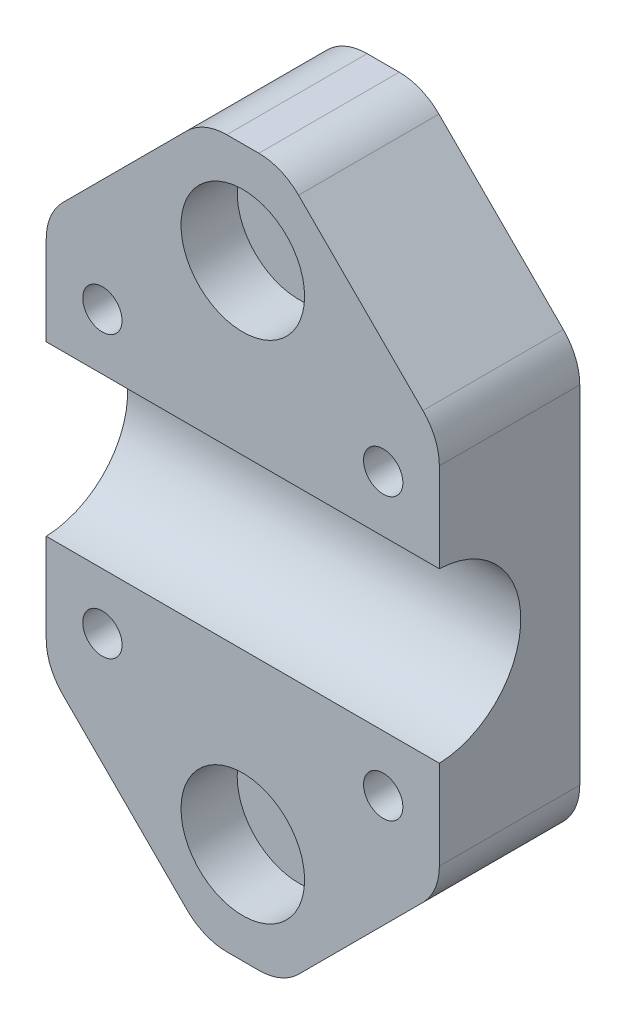
ISO-10303-21;
HEADER;
FILE_DESCRIPTION(('STEP AP214'),'2;1');
FILE_NAME('part.step','',(''),(''),'','','');
FILE_SCHEMA(('AUTOMOTIVE_DESIGN { 1 0 10303 214 1 1 1 1 }'));
ENDSEC;
DATA;
#1=APPLICATION_CONTEXT('core data for automotive mechanical design processes');
#2=APPLICATION_PROTOCOL_DEFINITION('international standard','automotive_design',2000,#1);
#3=PRODUCT_CONTEXT('',#1,'mechanical');
#4=PRODUCT('Part','Part','',(#3));
#5=PRODUCT_RELATED_PRODUCT_CATEGORY('part','',(#4));
#6=PRODUCT_DEFINITION_FORMATION('','',#4);
#7=PRODUCT_DEFINITION_CONTEXT('part definition',#1,'design');
#8=PRODUCT_DEFINITION('design','',#6,#7);
#9=PRODUCT_DEFINITION_SHAPE('','',#8);
#10=(LENGTH_UNIT() NAMED_UNIT(*) SI_UNIT(.MILLI.,.METRE.));
#11=(NAMED_UNIT(*) PLANE_ANGLE_UNIT() SI_UNIT($,.RADIAN.));
#12=(NAMED_UNIT(*) SI_UNIT($,.STERADIAN.) SOLID_ANGLE_UNIT());
#13=UNCERTAINTY_MEASURE_WITH_UNIT(LENGTH_MEASURE(1.E-05),#10,'distance_accuracy_value','');
#14=(GEOMETRIC_REPRESENTATION_CONTEXT(3) GLOBAL_UNCERTAINTY_ASSIGNED_CONTEXT((#13)) GLOBAL_UNIT_ASSIGNED_CONTEXT((#10,
#11,#12)) REPRESENTATION_CONTEXT('',''));
#15=CARTESIAN_POINT('',(0.,0.,0.));
#16=DIRECTION('',(0.,0.,1.));
#17=DIRECTION('',(1.,0.,0.));
#18=AXIS2_PLACEMENT_3D('',#15,#16,#17);
#19=CARTESIAN_POINT('',(0.,0.,12.5));
#20=DIRECTION('',(0.,0.,1.));
#21=DIRECTION('',(1.,0.,0.));
#22=AXIS2_PLACEMENT_3D('',#19,#20,#21);
#23=PLANE('',#22);
#24=CARTESIAN_POINT('',(-12.5,-12.5,12.5));
#25=DIRECTION('',(0.,0.,1.));
#26=DIRECTION('',(-1.,0.,0.));
#27=AXIS2_PLACEMENT_3D('',#24,#25,#26);
#28=CIRCLE('',#27,1.75);
#29=CARTESIAN_POINT('',(-14.25,-12.5,12.5));
#30=VERTEX_POINT('',#29);
#31=EDGE_CURVE('E529',#30,#30,#28,.T.);
#32=ORIENTED_EDGE('',*,*,#31,.F.);
#33=EDGE_LOOP('',(#32));
#34=FACE_BOUND('',#33,.T.);
#35=CARTESIAN_POINT('',(12.5,-12.5,12.5));
#36=DIRECTION('',(0.,0.,1.));
#37=DIRECTION('',(1.,0.,0.));
#38=AXIS2_PLACEMENT_3D('',#35,#36,#37);
#39=CIRCLE('',#38,1.75);
#40=CARTESIAN_POINT('',(14.25,-12.5,12.5));
#41=VERTEX_POINT('',#40);
#42=EDGE_CURVE('E528',#41,#41,#39,.T.);
#43=ORIENTED_EDGE('',*,*,#42,.F.);
#44=EDGE_LOOP('',(#43));
#45=FACE_BOUND('',#44,.T.);
#46=CARTESIAN_POINT('',(0.,-22.5,12.5));
#47=DIRECTION('',(0.,0.,1.));
#48=DIRECTION('',(-1.,0.,0.));
#49=AXIS2_PLACEMENT_3D('',#46,#47,#48);
#50=CIRCLE('',#49,5.5);
#51=CARTESIAN_POINT('',(-5.5,-22.5,12.5));
#52=VERTEX_POINT('',#51);
#53=EDGE_CURVE('E412',#52,#52,#50,.T.);
#54=ORIENTED_EDGE('',*,*,#53,.F.);
#55=EDGE_LOOP('',(#54));
#56=FACE_BOUND('',#55,.T.);
#57=DIRECTION('',(0.707106781186547,-0.707106781186547,0.));
#58=VECTOR('',#57,1.);
#59=CARTESIAN_POINT('',(-3.5,-31.5,12.5));
#60=LINE('',#59,#58);
#61=CARTESIAN_POINT('',(-16.0355339059327,-18.9644660940673,12.5));
#62=VERTEX_POINT('',#61);
#63=CARTESIAN_POINT('',(-4.96446609406727,-30.0355339059327,12.5));
#64=VERTEX_POINT('',#63);
#65=EDGE_CURVE('E171',#62,#64,#60,.T.);
#66=ORIENTED_EDGE('',*,*,#65,.T.);
#67=CARTESIAN_POINT('',(-1.42893218813453,-26.5,12.5));
#68=DIRECTION('',(0.,0.,1.));
#69=DIRECTION('',(1.,0.,0.));
#70=AXIS2_PLACEMENT_3D('',#67,#68,#69);
#71=CIRCLE('',#70,5.);
#72=CARTESIAN_POINT('',(-1.42893218813453,-31.5,12.5));
#73=VERTEX_POINT('',#72);
#74=EDGE_CURVE('E269',#64,#73,#71,.T.);
#75=ORIENTED_EDGE('',*,*,#74,.T.);
#76=DIRECTION('',(1.,0.,0.));
#77=VECTOR('',#76,1.);
#78=CARTESIAN_POINT('',(3.5,-31.5,12.5));
#79=LINE('',#78,#77);
#80=CARTESIAN_POINT('',(1.42893218813453,-31.5,12.5));
#81=VERTEX_POINT('',#80);
#82=EDGE_CURVE('E205',#73,#81,#79,.T.);
#83=ORIENTED_EDGE('',*,*,#82,.T.);
#84=CARTESIAN_POINT('',(1.42893218813453,-26.5,12.5));
#85=DIRECTION('',(0.,0.,1.));
#86=DIRECTION('',(1.,0.,0.));
#87=AXIS2_PLACEMENT_3D('',#84,#85,#86);
#88=CIRCLE('',#87,5.);
#89=CARTESIAN_POINT('',(4.96446609406726,-30.0355339059327,12.5));
#90=VERTEX_POINT('',#89);
#91=EDGE_CURVE('E267',#81,#90,#88,.T.);
#92=ORIENTED_EDGE('',*,*,#91,.T.);
#93=DIRECTION('',(0.707106781186547,0.707106781186547,0.));
#94=VECTOR('',#93,1.);
#95=CARTESIAN_POINT('',(3.5,-31.5,12.5));
#96=LINE('',#95,#94);
#97=CARTESIAN_POINT('',(16.0355339059327,-18.9644660940673,12.5));
#98=VERTEX_POINT('',#97);
#99=EDGE_CURVE('E208',#90,#98,#96,.T.);
#100=ORIENTED_EDGE('',*,*,#99,.T.);
#101=CARTESIAN_POINT('',(12.5,-15.4289321881345,12.5));
#102=DIRECTION('',(0.,0.,1.));
#103=DIRECTION('',(1.,0.,0.));
#104=AXIS2_PLACEMENT_3D('',#101,#102,#103);
#105=CIRCLE('',#104,5.);
#106=CARTESIAN_POINT('',(17.5,-15.4289321881345,12.5));
#107=VERTEX_POINT('',#106);
#108=EDGE_CURVE('E265',#98,#107,#105,.T.);
#109=ORIENTED_EDGE('',*,*,#108,.T.);
#110=DIRECTION('',(0.,1.,0.));
#111=VECTOR('',#110,1.);
#112=CARTESIAN_POINT('',(17.5,17.5,12.5));
#113=LINE('',#112,#111);
#114=CARTESIAN_POINT('',(17.5,-7.49583217528247,12.5));
#115=VERTEX_POINT('',#114);
#116=EDGE_CURVE('E212',#107,#115,#113,.T.);
#117=ORIENTED_EDGE('',*,*,#116,.T.);
#118=DIRECTION('',(1.,0.,0.));
#119=VECTOR('',#118,1.);
#120=CARTESIAN_POINT('',(-17.501,-7.49583217528247,12.5));
#121=LINE('',#120,#119);
#122=CARTESIAN_POINT('',(-17.5,-7.49583217528247,12.5));
#123=VERTEX_POINT('',#122);
#124=EDGE_CURVE('E181',#123,#115,#121,.T.);
#125=ORIENTED_EDGE('',*,*,#124,.F.);
#126=DIRECTION('',(0.,-1.,0.));
#127=VECTOR('',#126,1.);
#128=CARTESIAN_POINT('',(-17.5,17.5,12.5));
#129=LINE('',#128,#127);
#130=CARTESIAN_POINT('',(-17.5,-15.4289321881345,12.5));
#131=VERTEX_POINT('',#130);
#132=EDGE_CURVE('E172',#123,#131,#129,.T.);
#133=ORIENTED_EDGE('',*,*,#132,.T.);
#134=CARTESIAN_POINT('',(-12.5,-15.4289321881345,12.5));
#135=DIRECTION('',(0.,0.,1.));
#136=DIRECTION('',(1.,0.,0.));
#137=AXIS2_PLACEMENT_3D('',#134,#135,#136);
#138=CIRCLE('',#137,5.);
#139=EDGE_CURVE('E263',#131,#62,#138,.T.);
#140=ORIENTED_EDGE('',*,*,#139,.T.);
#141=EDGE_LOOP('',(#66,#75,#83,#92,#100,#109,#117,#125,#133,#140));
#142=FACE_BOUND('',#141,.T.);
#143=ADVANCED_FACE('F37',(#34,#45,#56,#142),#23,.T.);
#144=CARTESIAN_POINT('',(3.5,31.5,12.5));
#145=DIRECTION('',(0.,-1.,0.));
#146=DIRECTION('',(0.,0.,-1.));
#147=AXIS2_PLACEMENT_3D('',#144,#145,#146);
#148=PLANE('',#147);
#149=DIRECTION('',(-1.,0.,0.));
#150=VECTOR('',#149,1.);
#151=CARTESIAN_POINT('',(3.5,31.5,12.5));
#152=LINE('',#151,#150);
#153=CARTESIAN_POINT('',(1.42893218813453,31.5,12.5));
#154=VERTEX_POINT('',#153);
#155=CARTESIAN_POINT('',(-1.42893218813453,31.5,12.5));
#156=VERTEX_POINT('',#155);
#157=EDGE_CURVE('E197',#154,#156,#152,.T.);
#158=ORIENTED_EDGE('',*,*,#157,.F.);
#159=DIRECTION('',(0.,0.,-1.));
#160=VECTOR('',#159,1.);
#161=CARTESIAN_POINT('',(1.42893218813453,31.5,12.5));
#162=LINE('',#161,#160);
#163=CARTESIAN_POINT('',(1.42893218813453,31.5,0.));
#164=VERTEX_POINT('',#163);
#165=EDGE_CURVE('E299',#154,#164,#162,.T.);
#166=ORIENTED_EDGE('',*,*,#165,.T.);
#167=DIRECTION('',(-1.,0.,0.));
#168=VECTOR('',#167,1.);
#169=CARTESIAN_POINT('',(3.5,31.5,0.));
#170=LINE('',#169,#168);
#171=CARTESIAN_POINT('',(-1.42893218813453,31.5,0.));
#172=VERTEX_POINT('',#171);
#173=EDGE_CURVE('E195',#164,#172,#170,.T.);
#174=ORIENTED_EDGE('',*,*,#173,.T.);
#175=DIRECTION('',(0.,0.,-1.));
#176=VECTOR('',#175,1.);
#177=CARTESIAN_POINT('',(-1.42893218813453,31.5,12.5));
#178=LINE('',#177,#176);
#179=EDGE_CURVE('E297',#172,#156,#178,.F.);
#180=ORIENTED_EDGE('',*,*,#179,.T.);
#181=EDGE_LOOP('',(#158,#166,#174,#180));
#182=FACE_BOUND('',#181,.T.);
#183=ADVANCED_FACE('F305',(#182),#148,.F.);
#184=CARTESIAN_POINT('',(-3.5,31.5,12.5));
#185=DIRECTION('',(0.707106781186547,-0.707106781186547,0.));
#186=DIRECTION('',(0.707106781186547,0.707106781186548,0.));
#187=AXIS2_PLACEMENT_3D('',#184,#185,#186);
#188=PLANE('',#187);
#189=DIRECTION('',(-0.707106781186547,-0.707106781186547,0.));
#190=VECTOR('',#189,1.);
#191=CARTESIAN_POINT('',(-3.5,31.5,12.5));
#192=LINE('',#191,#190);
#193=CARTESIAN_POINT('',(-4.96446609406727,30.0355339059327,12.5));
#194=VERTEX_POINT('',#193);
#195=CARTESIAN_POINT('',(-16.0355339059327,18.9644660940673,12.5));
#196=VERTEX_POINT('',#195);
#197=EDGE_CURVE('E200',#194,#196,#192,.T.);
#198=ORIENTED_EDGE('',*,*,#197,.F.);
#199=DIRECTION('',(0.,0.,-1.));
#200=VECTOR('',#199,1.);
#201=CARTESIAN_POINT('',(-4.96446609406727,30.0355339059327,12.5));
#202=LINE('',#201,#200);
#203=CARTESIAN_POINT('',(-4.96446609406727,30.0355339059327,0.));
#204=VERTEX_POINT('',#203);
#205=EDGE_CURVE('E11',#194,#204,#202,.T.);
#206=ORIENTED_EDGE('',*,*,#205,.T.);
#207=DIRECTION('',(-0.707106781186547,-0.707106781186547,0.));
#208=VECTOR('',#207,1.);
#209=CARTESIAN_POINT('',(-3.5,31.5,0.));
#210=LINE('',#209,#208);
#211=CARTESIAN_POINT('',(-16.0355339059327,18.9644660940673,0.));
#212=VERTEX_POINT('',#211);
#213=EDGE_CURVE('E220',#204,#212,#210,.T.);
#214=ORIENTED_EDGE('',*,*,#213,.T.);
#215=DIRECTION('',(0.,0.,-1.));
#216=VECTOR('',#215,1.);
#217=CARTESIAN_POINT('',(-16.0355339059327,18.9644660940673,12.5));
#218=LINE('',#217,#216);
#219=EDGE_CURVE('E45',#212,#196,#218,.F.);
#220=ORIENTED_EDGE('',*,*,#219,.T.);
#221=EDGE_LOOP('',(#198,#206,#214,#220));
#222=FACE_BOUND('',#221,.T.);
#223=ADVANCED_FACE('F318',(#222),#188,.F.);
#224=CARTESIAN_POINT('',(-17.5,17.5,12.5));
#225=DIRECTION('',(1.,0.,0.));
#226=DIRECTION('',(0.,0.,-1.));
#227=AXIS2_PLACEMENT_3D('',#224,#225,#226);
#228=PLANE('',#227);
#229=DIRECTION('',(0.,-1.,0.));
#230=VECTOR('',#229,1.);
#231=CARTESIAN_POINT('',(-17.5,17.5,0.));
#232=LINE('',#231,#230);
#233=CARTESIAN_POINT('',(-17.5,15.4289321881345,0.));
#234=VERTEX_POINT('',#233);
#235=CARTESIAN_POINT('',(-17.5,-15.4289321881345,0.));
#236=VERTEX_POINT('',#235);
#237=EDGE_CURVE('E222',#234,#236,#232,.T.);
#238=ORIENTED_EDGE('',*,*,#237,.T.);
#239=DIRECTION('',(0.,0.,-1.));
#240=VECTOR('',#239,1.);
#241=CARTESIAN_POINT('',(-17.5,-15.4289321881345,12.5));
#242=LINE('',#241,#240);
#243=EDGE_CURVE('E295',#236,#131,#242,.F.);
#244=ORIENTED_EDGE('',*,*,#243,.T.);
#245=ORIENTED_EDGE('',*,*,#132,.F.);
#246=CARTESIAN_POINT('',(-17.5,0.,12.75));
#247=DIRECTION('',(1.,0.,0.));
#248=DIRECTION('',(0.,0.,-1.));
#249=AXIS2_PLACEMENT_3D('',#246,#247,#248);
#250=CIRCLE('',#249,7.5);
#251=CARTESIAN_POINT('',(-17.5,7.49583217528247,12.5));
#252=VERTEX_POINT('',#251);
#253=EDGE_CURVE('E177',#252,#123,#250,.F.);
#254=ORIENTED_EDGE('',*,*,#253,.F.);
#255=CARTESIAN_POINT('',(-17.5,15.4289321881345,12.5));
#256=VERTEX_POINT('',#255);
#257=EDGE_CURVE('E161',#256,#252,#129,.T.);
#258=ORIENTED_EDGE('',*,*,#257,.F.);
#259=DIRECTION('',(0.,0.,-1.));
#260=VECTOR('',#259,1.);
#261=CARTESIAN_POINT('',(-17.5,15.4289321881345,12.5));
#262=LINE('',#261,#260);
#263=EDGE_CURVE('E293',#256,#234,#262,.T.);
#264=ORIENTED_EDGE('',*,*,#263,.T.);
#265=EDGE_LOOP('',(#238,#244,#245,#254,#258,#264));
#266=FACE_BOUND('',#265,.T.);
#267=ADVANCED_FACE('F185',(#266),#228,.F.);
#268=CARTESIAN_POINT('',(-3.5,-31.5,12.5));
#269=DIRECTION('',(0.707106781186547,0.707106781186547,0.));
#270=DIRECTION('',(-0.707106781186547,0.707106781186548,0.));
#271=AXIS2_PLACEMENT_3D('',#268,#269,#270);
#272=PLANE('',#271);
#273=DIRECTION('',(0.707106781186547,-0.707106781186547,0.));
#274=VECTOR('',#273,1.);
#275=CARTESIAN_POINT('',(-3.5,-31.5,0.));
#276=LINE('',#275,#274);
#277=CARTESIAN_POINT('',(-16.0355339059327,-18.9644660940673,0.));
#278=VERTEX_POINT('',#277);
#279=CARTESIAN_POINT('',(-4.96446609406727,-30.0355339059327,0.));
#280=VERTEX_POINT('',#279);
#281=EDGE_CURVE('E224',#278,#280,#276,.T.);
#282=ORIENTED_EDGE('',*,*,#281,.T.);
#283=DIRECTION('',(0.,0.,-1.));
#284=VECTOR('',#283,1.);
#285=CARTESIAN_POINT('',(-4.96446609406727,-30.0355339059327,12.5));
#286=LINE('',#285,#284);
#287=EDGE_CURVE('E261',#280,#64,#286,.F.);
#288=ORIENTED_EDGE('',*,*,#287,.T.);
#289=ORIENTED_EDGE('',*,*,#65,.F.);
#290=DIRECTION('',(0.,0.,-1.));
#291=VECTOR('',#290,1.);
#292=CARTESIAN_POINT('',(-16.0355339059327,-18.9644660940673,12.5));
#293=LINE('',#292,#291);
#294=EDGE_CURVE('E258',#62,#278,#293,.T.);
#295=ORIENTED_EDGE('',*,*,#294,.T.);
#296=EDGE_LOOP('',(#282,#288,#289,#295));
#297=FACE_BOUND('',#296,.T.);
#298=ADVANCED_FACE('F329',(#297),#272,.F.);
#299=CARTESIAN_POINT('',(3.5,-31.5,12.5));
#300=DIRECTION('',(0.,1.,0.));
#301=DIRECTION('',(0.,0.,1.));
#302=AXIS2_PLACEMENT_3D('',#299,#300,#301);
#303=PLANE('',#302);
#304=ORIENTED_EDGE('',*,*,#82,.F.);
#305=DIRECTION('',(0.,0.,-1.));
#306=VECTOR('',#305,1.);
#307=CARTESIAN_POINT('',(-1.42893218813453,-31.5,12.5));
#308=LINE('',#307,#306);
#309=CARTESIAN_POINT('',(-1.42893218813453,-31.5,0.));
#310=VERTEX_POINT('',#309);
#311=EDGE_CURVE('E239',#73,#310,#308,.T.);
#312=ORIENTED_EDGE('',*,*,#311,.T.);
#313=DIRECTION('',(1.,0.,0.));
#314=VECTOR('',#313,1.);
#315=CARTESIAN_POINT('',(3.5,-31.5,0.));
#316=LINE('',#315,#314);
#317=CARTESIAN_POINT('',(1.42893218813453,-31.5,0.));
#318=VERTEX_POINT('',#317);
#319=EDGE_CURVE('E227',#310,#318,#316,.T.);
#320=ORIENTED_EDGE('',*,*,#319,.T.);
#321=DIRECTION('',(0.,0.,-1.));
#322=VECTOR('',#321,1.);
#323=CARTESIAN_POINT('',(1.42893218813453,-31.5,12.5));
#324=LINE('',#323,#322);
#325=EDGE_CURVE('E217',#318,#81,#324,.F.);
#326=ORIENTED_EDGE('',*,*,#325,.T.);
#327=EDGE_LOOP('',(#304,#312,#320,#326));
#328=FACE_BOUND('',#327,.T.);
#329=ADVANCED_FACE('F338',(#328),#303,.F.);
#330=CARTESIAN_POINT('',(3.5,-31.5,12.5));
#331=DIRECTION('',(-0.707106781186547,0.707106781186547,0.));
#332=DIRECTION('',(-0.707106781186547,-0.707106781186548,0.));
#333=AXIS2_PLACEMENT_3D('',#330,#331,#332);
#334=PLANE('',#333);
#335=ORIENTED_EDGE('',*,*,#99,.F.);
#336=DIRECTION('',(0.,0.,-1.));
#337=VECTOR('',#336,1.);
#338=CARTESIAN_POINT('',(4.96446609406726,-30.0355339059327,12.5));
#339=LINE('',#338,#337);
#340=CARTESIAN_POINT('',(4.96446609406726,-30.0355339059327,0.));
#341=VERTEX_POINT('',#340);
#342=EDGE_CURVE('E273',#90,#341,#339,.T.);
#343=ORIENTED_EDGE('',*,*,#342,.T.);
#344=DIRECTION('',(0.707106781186547,0.707106781186547,0.));
#345=VECTOR('',#344,1.);
#346=CARTESIAN_POINT('',(3.5,-31.5,0.));
#347=LINE('',#346,#345);
#348=CARTESIAN_POINT('',(16.0355339059327,-18.9644660940673,0.));
#349=VERTEX_POINT('',#348);
#350=EDGE_CURVE('E230',#341,#349,#347,.T.);
#351=ORIENTED_EDGE('',*,*,#350,.T.);
#352=DIRECTION('',(0.,0.,-1.));
#353=VECTOR('',#352,1.);
#354=CARTESIAN_POINT('',(16.0355339059327,-18.9644660940673,12.5));
#355=LINE('',#354,#353);
#356=EDGE_CURVE('E271',#349,#98,#355,.F.);
#357=ORIENTED_EDGE('',*,*,#356,.T.);
#358=EDGE_LOOP('',(#335,#343,#351,#357));
#359=FACE_BOUND('',#358,.T.);
#360=ADVANCED_FACE('F347',(#359),#334,.F.);
#361=CARTESIAN_POINT('',(17.5,17.5,12.5));
#362=DIRECTION('',(-1.,0.,0.));
#363=DIRECTION('',(0.,0.,1.));
#364=AXIS2_PLACEMENT_3D('',#361,#362,#363);
#365=PLANE('',#364);
#366=ORIENTED_EDGE('',*,*,#116,.F.);
#367=DIRECTION('',(0.,0.,-1.));
#368=VECTOR('',#367,1.);
#369=CARTESIAN_POINT('',(17.5,-15.4289321881345,12.5));
#370=LINE('',#369,#368);
#371=CARTESIAN_POINT('',(17.5,-15.4289321881345,0.));
#372=VERTEX_POINT('',#371);
#373=EDGE_CURVE('E278',#107,#372,#370,.T.);
#374=ORIENTED_EDGE('',*,*,#373,.T.);
#375=DIRECTION('',(0.,1.,0.));
#376=VECTOR('',#375,1.);
#377=CARTESIAN_POINT('',(17.5,17.5,0.));
#378=LINE('',#377,#376);
#379=CARTESIAN_POINT('',(17.5,15.4289321881345,0.));
#380=VERTEX_POINT('',#379);
#381=EDGE_CURVE('E233',#372,#380,#378,.T.);
#382=ORIENTED_EDGE('',*,*,#381,.T.);
#383=DIRECTION('',(0.,0.,-1.));
#384=VECTOR('',#383,1.);
#385=CARTESIAN_POINT('',(17.5,15.4289321881345,12.5));
#386=LINE('',#385,#384);
#387=CARTESIAN_POINT('',(17.5,15.4289321881345,12.5));
#388=VERTEX_POINT('',#387);
#389=EDGE_CURVE('E276',#380,#388,#386,.F.);
#390=ORIENTED_EDGE('',*,*,#389,.T.);
#391=CARTESIAN_POINT('',(17.5,7.49583217528247,12.5));
#392=VERTEX_POINT('',#391);
#393=EDGE_CURVE('E211',#392,#388,#113,.T.);
#394=ORIENTED_EDGE('',*,*,#393,.F.);
#395=CARTESIAN_POINT('',(17.5,0.,12.75));
#396=DIRECTION('',(1.,0.,0.));
#397=DIRECTION('',(0.,0.,-1.));
#398=AXIS2_PLACEMENT_3D('',#395,#396,#397);
#399=CIRCLE('',#398,7.5);
#400=EDGE_CURVE('E180',#115,#392,#399,.T.);
#401=ORIENTED_EDGE('',*,*,#400,.F.);
#402=EDGE_LOOP('',(#366,#374,#382,#390,#394,#401));
#403=FACE_BOUND('',#402,.T.);
#404=ADVANCED_FACE('F356',(#403),#365,.F.);
#405=CARTESIAN_POINT('',(3.5,31.5,12.5));
#406=DIRECTION('',(-0.707106781186547,-0.707106781186547,0.));
#407=DIRECTION('',(0.707106781186547,-0.707106781186548,0.));
#408=AXIS2_PLACEMENT_3D('',#405,#406,#407);
#409=PLANE('',#408);
#410=DIRECTION('',(-0.707106781186547,0.707106781186547,0.));
#411=VECTOR('',#410,1.);
#412=CARTESIAN_POINT('',(3.5,31.5,12.5));
#413=LINE('',#412,#411);
#414=CARTESIAN_POINT('',(16.0355339059327,18.9644660940673,12.5));
#415=VERTEX_POINT('',#414);
#416=CARTESIAN_POINT('',(4.96446609406726,30.0355339059327,12.5));
#417=VERTEX_POINT('',#416);
#418=EDGE_CURVE('E214',#415,#417,#413,.T.);
#419=ORIENTED_EDGE('',*,*,#418,.F.);
#420=DIRECTION('',(0.,0.,-1.));
#421=VECTOR('',#420,1.);
#422=CARTESIAN_POINT('',(16.0355339059327,18.9644660940673,12.5));
#423=LINE('',#422,#421);
#424=CARTESIAN_POINT('',(16.0355339059327,18.9644660940673,0.));
#425=VERTEX_POINT('',#424);
#426=EDGE_CURVE('E283',#415,#425,#423,.T.);
#427=ORIENTED_EDGE('',*,*,#426,.T.);
#428=DIRECTION('',(-0.707106781186547,0.707106781186547,0.));
#429=VECTOR('',#428,1.);
#430=CARTESIAN_POINT('',(3.5,31.5,0.));
#431=LINE('',#430,#429);
#432=CARTESIAN_POINT('',(4.96446609406726,30.0355339059327,0.));
#433=VERTEX_POINT('',#432);
#434=EDGE_CURVE('E201',#425,#433,#431,.T.);
#435=ORIENTED_EDGE('',*,*,#434,.T.);
#436=DIRECTION('',(0.,0.,-1.));
#437=VECTOR('',#436,1.);
#438=CARTESIAN_POINT('',(4.96446609406726,30.0355339059327,12.5));
#439=LINE('',#438,#437);
#440=EDGE_CURVE('E281',#433,#417,#439,.F.);
#441=ORIENTED_EDGE('',*,*,#440,.T.);
#442=EDGE_LOOP('',(#419,#427,#435,#441));
#443=FACE_BOUND('',#442,.T.);
#444=ADVANCED_FACE('F364',(#443),#409,.F.);
#445=CARTESIAN_POINT('',(12.5,12.5,12.5));
#446=DIRECTION('',(0.,0.,1.));
#447=DIRECTION('',(-1.,0.,0.));
#448=AXIS2_PLACEMENT_3D('',#445,#446,#447);
#449=CIRCLE('',#448,1.75);
#450=CARTESIAN_POINT('',(10.75,12.5,12.5));
#451=VERTEX_POINT('',#450);
#452=EDGE_CURVE('E396',#451,#451,#449,.T.);
#453=ORIENTED_EDGE('',*,*,#452,.F.);
#454=EDGE_LOOP('',(#453));
#455=FACE_BOUND('',#454,.T.);
#456=CARTESIAN_POINT('',(-12.5,12.5,12.5));
#457=DIRECTION('',(0.,0.,1.));
#458=DIRECTION('',(1.,0.,0.));
#459=AXIS2_PLACEMENT_3D('',#456,#457,#458);
#460=CIRCLE('',#459,1.75);
#461=CARTESIAN_POINT('',(-10.75,12.5,12.5));
#462=VERTEX_POINT('',#461);
#463=EDGE_CURVE('E400',#462,#462,#460,.T.);
#464=ORIENTED_EDGE('',*,*,#463,.F.);
#465=EDGE_LOOP('',(#464));
#466=FACE_BOUND('',#465,.T.);
#467=CARTESIAN_POINT('',(0.,22.5,12.5));
#468=DIRECTION('',(0.,0.,1.));
#469=DIRECTION('',(1.,0.,0.));
#470=AXIS2_PLACEMENT_3D('',#467,#468,#469);
#471=CIRCLE('',#470,5.5);
#472=CARTESIAN_POINT('',(5.5,22.5,12.5));
#473=VERTEX_POINT('',#472);
#474=EDGE_CURVE('E403',#473,#473,#471,.T.);
#475=ORIENTED_EDGE('',*,*,#474,.F.);
#476=EDGE_LOOP('',(#475));
#477=FACE_BOUND('',#476,.T.);
#478=ORIENTED_EDGE('',*,*,#393,.T.);
#479=CARTESIAN_POINT('',(12.5,15.4289321881345,12.5));
#480=DIRECTION('',(0.,0.,1.));
#481=DIRECTION('',(1.,0.,0.));
#482=AXIS2_PLACEMENT_3D('',#479,#480,#481);
#483=CIRCLE('',#482,5.);
#484=EDGE_CURVE('E291',#388,#415,#483,.T.);
#485=ORIENTED_EDGE('',*,*,#484,.T.);
#486=ORIENTED_EDGE('',*,*,#418,.T.);
#487=CARTESIAN_POINT('',(1.42893218813453,26.5,12.5));
#488=DIRECTION('',(0.,0.,1.));
#489=DIRECTION('',(1.,0.,0.));
#490=AXIS2_PLACEMENT_3D('',#487,#488,#489);
#491=CIRCLE('',#490,5.);
#492=EDGE_CURVE('E289',#417,#154,#491,.T.);
#493=ORIENTED_EDGE('',*,*,#492,.T.);
#494=ORIENTED_EDGE('',*,*,#157,.T.);
#495=CARTESIAN_POINT('',(-1.42893218813453,26.5,12.5));
#496=DIRECTION('',(0.,0.,1.));
#497=DIRECTION('',(1.,0.,0.));
#498=AXIS2_PLACEMENT_3D('',#495,#496,#497);
#499=CIRCLE('',#498,5.);
#500=EDGE_CURVE('E287',#156,#194,#499,.T.);
#501=ORIENTED_EDGE('',*,*,#500,.T.);
#502=ORIENTED_EDGE('',*,*,#197,.T.);
#503=CARTESIAN_POINT('',(-12.5,15.4289321881345,12.5));
#504=DIRECTION('',(0.,0.,1.));
#505=DIRECTION('',(1.,0.,0.));
#506=AXIS2_PLACEMENT_3D('',#503,#504,#505);
#507=CIRCLE('',#506,5.);
#508=EDGE_CURVE('E52',#196,#256,#507,.T.);
#509=ORIENTED_EDGE('',*,*,#508,.T.);
#510=ORIENTED_EDGE('',*,*,#257,.T.);
#511=DIRECTION('',(1.,0.,0.));
#512=VECTOR('',#511,1.);
#513=CARTESIAN_POINT('',(-17.501,7.49583217528247,12.5));
#514=LINE('',#513,#512);
#515=EDGE_CURVE('E165',#252,#392,#514,.T.);
#516=ORIENTED_EDGE('',*,*,#515,.T.);
#517=EDGE_LOOP('',(#478,#485,#486,#493,#494,#501,#502,#509,#510,#516));
#518=FACE_BOUND('',#517,.T.);
#519=ADVANCED_FACE('F164',(#455,#466,#477,#518),#23,.T.);
#520=CARTESIAN_POINT('',(0.,0.,0.));
#521=DIRECTION('',(0.,0.,1.));
#522=DIRECTION('',(1.,0.,0.));
#523=AXIS2_PLACEMENT_3D('',#520,#521,#522);
#524=PLANE('',#523);
#525=CARTESIAN_POINT('',(12.5,-12.5,0.));
#526=DIRECTION('',(0.,0.,-1.));
#527=DIRECTION('',(1.,0.,0.));
#528=AXIS2_PLACEMENT_3D('',#525,#526,#527);
#529=CIRCLE('',#528,3.);
#530=CARTESIAN_POINT('',(15.5,-12.5,0.));
#531=VERTEX_POINT('',#530);
#532=EDGE_CURVE('E409',#531,#531,#529,.T.);
#533=ORIENTED_EDGE('',*,*,#532,.F.);
#534=EDGE_LOOP('',(#533));
#535=FACE_BOUND('',#534,.T.);
#536=CARTESIAN_POINT('',(-12.5,-12.5,0.));
#537=DIRECTION('',(0.,0.,-1.));
#538=DIRECTION('',(-1.,0.,0.));
#539=AXIS2_PLACEMENT_3D('',#536,#537,#538);
#540=CIRCLE('',#539,3.);
#541=CARTESIAN_POINT('',(-15.5,-12.5,0.));
#542=VERTEX_POINT('',#541);
#543=EDGE_CURVE('E419',#542,#542,#540,.T.);
#544=ORIENTED_EDGE('',*,*,#543,.F.);
#545=EDGE_LOOP('',(#544));
#546=FACE_BOUND('',#545,.T.);
#547=CARTESIAN_POINT('',(-12.5,12.5,0.));
#548=DIRECTION('',(0.,0.,-1.));
#549=DIRECTION('',(1.,0.,0.));
#550=AXIS2_PLACEMENT_3D('',#547,#548,#549);
#551=CIRCLE('',#550,3.);
#552=CARTESIAN_POINT('',(-9.5,12.5,0.));
#553=VERTEX_POINT('',#552);
#554=EDGE_CURVE('E425',#553,#553,#551,.T.);
#555=ORIENTED_EDGE('',*,*,#554,.F.);
#556=EDGE_LOOP('',(#555));
#557=FACE_BOUND('',#556,.T.);
#558=CARTESIAN_POINT('',(12.5,12.5,0.));
#559=DIRECTION('',(0.,0.,-1.));
#560=DIRECTION('',(-1.,0.,0.));
#561=AXIS2_PLACEMENT_3D('',#558,#559,#560);
#562=CIRCLE('',#561,3.);
#563=CARTESIAN_POINT('',(9.5,12.5,0.));
#564=VERTEX_POINT('',#563);
#565=EDGE_CURVE('E191',#564,#564,#562,.T.);
#566=ORIENTED_EDGE('',*,*,#565,.F.);
#567=EDGE_LOOP('',(#566));
#568=FACE_BOUND('',#567,.T.);
#569=ORIENTED_EDGE('',*,*,#319,.F.);
#570=CARTESIAN_POINT('',(-1.42893218813453,-26.5,0.));
#571=DIRECTION('',(0.,0.,1.));
#572=DIRECTION('',(1.,0.,0.));
#573=AXIS2_PLACEMENT_3D('',#570,#571,#572);
#574=CIRCLE('',#573,5.);
#575=EDGE_CURVE('E256',#310,#280,#574,.F.);
#576=ORIENTED_EDGE('',*,*,#575,.T.);
#577=ORIENTED_EDGE('',*,*,#281,.F.);
#578=CARTESIAN_POINT('',(-12.5,-15.4289321881345,0.));
#579=DIRECTION('',(0.,0.,1.));
#580=DIRECTION('',(1.,0.,0.));
#581=AXIS2_PLACEMENT_3D('',#578,#579,#580);
#582=CIRCLE('',#581,5.);
#583=EDGE_CURVE('E248',#278,#236,#582,.F.);
#584=ORIENTED_EDGE('',*,*,#583,.T.);
#585=ORIENTED_EDGE('',*,*,#237,.F.);
#586=CARTESIAN_POINT('',(-12.5,15.4289321881345,0.));
#587=DIRECTION('',(0.,0.,1.));
#588=DIRECTION('',(1.,0.,0.));
#589=AXIS2_PLACEMENT_3D('',#586,#587,#588);
#590=CIRCLE('',#589,5.);
#591=EDGE_CURVE('E242',#234,#212,#590,.F.);
#592=ORIENTED_EDGE('',*,*,#591,.T.);
#593=ORIENTED_EDGE('',*,*,#213,.F.);
#594=CARTESIAN_POINT('',(-1.42893218813453,26.5,0.));
#595=DIRECTION('',(0.,0.,1.));
#596=DIRECTION('',(1.,0.,0.));
#597=AXIS2_PLACEMENT_3D('',#594,#595,#596);
#598=CIRCLE('',#597,5.);
#599=EDGE_CURVE('E244',#204,#172,#598,.F.);
#600=ORIENTED_EDGE('',*,*,#599,.T.);
#601=ORIENTED_EDGE('',*,*,#173,.F.);
#602=CARTESIAN_POINT('',(1.42893218813453,26.5,0.));
#603=DIRECTION('',(0.,0.,1.));
#604=DIRECTION('',(1.,0.,0.));
#605=AXIS2_PLACEMENT_3D('',#602,#603,#604);
#606=CIRCLE('',#605,5.);
#607=EDGE_CURVE('E246',#164,#433,#606,.F.);
#608=ORIENTED_EDGE('',*,*,#607,.T.);
#609=ORIENTED_EDGE('',*,*,#434,.F.);
#610=CARTESIAN_POINT('',(12.5,15.4289321881345,0.));
#611=DIRECTION('',(0.,0.,1.));
#612=DIRECTION('',(1.,0.,0.));
#613=AXIS2_PLACEMENT_3D('',#610,#611,#612);
#614=CIRCLE('',#613,5.);
#615=EDGE_CURVE('E250',#425,#380,#614,.F.);
#616=ORIENTED_EDGE('',*,*,#615,.T.);
#617=ORIENTED_EDGE('',*,*,#381,.F.);
#618=CARTESIAN_POINT('',(12.5,-15.4289321881345,0.));
#619=DIRECTION('',(0.,0.,1.));
#620=DIRECTION('',(1.,0.,0.));
#621=AXIS2_PLACEMENT_3D('',#618,#619,#620);
#622=CIRCLE('',#621,5.);
#623=EDGE_CURVE('E252',#372,#349,#622,.F.);
#624=ORIENTED_EDGE('',*,*,#623,.T.);
#625=ORIENTED_EDGE('',*,*,#350,.F.);
#626=CARTESIAN_POINT('',(1.42893218813453,-26.5,0.));
#627=DIRECTION('',(0.,0.,1.));
#628=DIRECTION('',(1.,0.,0.));
#629=AXIS2_PLACEMENT_3D('',#626,#627,#628);
#630=CIRCLE('',#629,5.);
#631=EDGE_CURVE('E254',#341,#318,#630,.F.);
#632=ORIENTED_EDGE('',*,*,#631,.T.);
#633=EDGE_LOOP('',(#569,#576,#577,#584,#585,#592,#593,#600,#601,#608,#609,#616,#617,#624,#625,#632));
#634=FACE_BOUND('',#633,.T.);
#635=ADVANCED_FACE('F311',(#535,#546,#557,#568,#634),#524,.F.);
#636=CARTESIAN_POINT('',(-17.501,0.,12.75));
#637=DIRECTION('',(1.,0.,0.));
#638=DIRECTION('',(0.,0.,-1.));
#639=AXIS2_PLACEMENT_3D('',#636,#637,#638);
#640=CYLINDRICAL_SURFACE('',#639,7.5);
#641=ORIENTED_EDGE('',*,*,#253,.T.);
#642=ORIENTED_EDGE('',*,*,#124,.T.);
#643=ORIENTED_EDGE('',*,*,#400,.T.);
#644=ORIENTED_EDGE('',*,*,#515,.F.);
#645=EDGE_LOOP('',(#641,#642,#643,#644));
#646=FACE_BOUND('',#645,.T.);
#647=ADVANCED_FACE('F175',(#646),#640,.F.);
#648=CARTESIAN_POINT('',(12.5,12.5,3.));
#649=DIRECTION('',(0.,0.,-1.));
#650=DIRECTION('',(-1.,0.,0.));
#651=AXIS2_PLACEMENT_3D('',#648,#649,#650);
#652=CYLINDRICAL_SURFACE('',#651,3.);
#653=CARTESIAN_POINT('',(12.5,12.5,3.));
#654=DIRECTION('',(0.,0.,-1.));
#655=DIRECTION('',(-1.,0.,0.));
#656=AXIS2_PLACEMENT_3D('',#653,#654,#655);
#657=CIRCLE('',#656,3.);
#658=CARTESIAN_POINT('',(9.5,12.5,3.));
#659=VERTEX_POINT('',#658);
#660=EDGE_CURVE('E187',#659,#659,#657,.T.);
#661=ORIENTED_EDGE('',*,*,#660,.F.);
#662=EDGE_LOOP('',(#661));
#663=FACE_BOUND('',#662,.T.);
#664=ORIENTED_EDGE('',*,*,#565,.T.);
#665=EDGE_LOOP('',(#664));
#666=FACE_BOUND('',#665,.T.);
#667=ADVANCED_FACE('F440',(#663,#666),#652,.F.);
#668=CARTESIAN_POINT('',(12.5,12.5,3.));
#669=DIRECTION('',(0.,0.,-1.));
#670=DIRECTION('',(-1.,0.,0.));
#671=AXIS2_PLACEMENT_3D('',#668,#669,#670);
#672=PLANE('',#671);
#673=ORIENTED_EDGE('',*,*,#660,.T.);
#674=EDGE_LOOP('',(#673));
#675=FACE_BOUND('',#674,.T.);
#676=ADVANCED_FACE('F442',(#675),#672,.T.);
#677=CARTESIAN_POINT('',(-12.5,12.5,3.));
#678=DIRECTION('',(0.,0.,-1.));
#679=DIRECTION('',(-1.,0.,0.));
#680=AXIS2_PLACEMENT_3D('',#677,#678,#679);
#681=CYLINDRICAL_SURFACE('',#680,3.);
#682=CARTESIAN_POINT('',(-12.5,12.5,3.));
#683=DIRECTION('',(0.,0.,-1.));
#684=DIRECTION('',(1.,0.,0.));
#685=AXIS2_PLACEMENT_3D('',#682,#683,#684);
#686=CIRCLE('',#685,3.);
#687=CARTESIAN_POINT('',(-9.5,12.5,3.));
#688=VERTEX_POINT('',#687);
#689=EDGE_CURVE('E428',#688,#688,#686,.T.);
#690=ORIENTED_EDGE('',*,*,#689,.F.);
#691=EDGE_LOOP('',(#690));
#692=FACE_BOUND('',#691,.T.);
#693=ORIENTED_EDGE('',*,*,#554,.T.);
#694=EDGE_LOOP('',(#693));
#695=FACE_BOUND('',#694,.T.);
#696=ADVANCED_FACE('F434',(#692,#695),#681,.F.);
#697=CARTESIAN_POINT('',(-12.5,12.5,3.));
#698=DIRECTION('',(0.,0.,1.));
#699=DIRECTION('',(1.,0.,0.));
#700=AXIS2_PLACEMENT_3D('',#697,#698,#699);
#701=PLANE('',#700);
#702=ORIENTED_EDGE('',*,*,#689,.T.);
#703=EDGE_LOOP('',(#702));
#704=FACE_BOUND('',#703,.T.);
#705=ADVANCED_FACE('F455',(#704),#701,.F.);
#706=CARTESIAN_POINT('',(-12.5,-12.5,3.));
#707=DIRECTION('',(0.,0.,-1.));
#708=DIRECTION('',(-1.,0.,0.));
#709=AXIS2_PLACEMENT_3D('',#706,#707,#708);
#710=CYLINDRICAL_SURFACE('',#709,3.);
#711=CARTESIAN_POINT('',(-12.5,-12.5,3.));
#712=DIRECTION('',(0.,0.,-1.));
#713=DIRECTION('',(-1.,0.,0.));
#714=AXIS2_PLACEMENT_3D('',#711,#712,#713);
#715=CIRCLE('',#714,3.);
#716=CARTESIAN_POINT('',(-15.5,-12.5,3.));
#717=VERTEX_POINT('',#716);
#718=EDGE_CURVE('E422',#717,#717,#715,.T.);
#719=ORIENTED_EDGE('',*,*,#718,.F.);
#720=EDGE_LOOP('',(#719));
#721=FACE_BOUND('',#720,.T.);
#722=ORIENTED_EDGE('',*,*,#543,.T.);
#723=EDGE_LOOP('',(#722));
#724=FACE_BOUND('',#723,.T.);
#725=ADVANCED_FACE('F459',(#721,#724),#710,.F.);
#726=CARTESIAN_POINT('',(-12.5,-12.5,3.));
#727=DIRECTION('',(0.,0.,-1.));
#728=DIRECTION('',(-1.,0.,0.));
#729=AXIS2_PLACEMENT_3D('',#726,#727,#728);
#730=PLANE('',#729);
#731=ORIENTED_EDGE('',*,*,#718,.T.);
#732=EDGE_LOOP('',(#731));
#733=FACE_BOUND('',#732,.T.);
#734=ADVANCED_FACE('F463',(#733),#730,.T.);
#735=CARTESIAN_POINT('',(12.5,-12.5,3.));
#736=DIRECTION('',(0.,0.,-1.));
#737=DIRECTION('',(-1.,0.,0.));
#738=AXIS2_PLACEMENT_3D('',#735,#736,#737);
#739=CYLINDRICAL_SURFACE('',#738,3.);
#740=CARTESIAN_POINT('',(12.5,-12.5,3.));
#741=DIRECTION('',(0.,0.,-1.));
#742=DIRECTION('',(1.,0.,0.));
#743=AXIS2_PLACEMENT_3D('',#740,#741,#742);
#744=CIRCLE('',#743,3.);
#745=CARTESIAN_POINT('',(15.5,-12.5,3.));
#746=VERTEX_POINT('',#745);
#747=EDGE_CURVE('E416',#746,#746,#744,.T.);
#748=ORIENTED_EDGE('',*,*,#747,.F.);
#749=EDGE_LOOP('',(#748));
#750=FACE_BOUND('',#749,.T.);
#751=ORIENTED_EDGE('',*,*,#532,.T.);
#752=EDGE_LOOP('',(#751));
#753=FACE_BOUND('',#752,.T.);
#754=ADVANCED_FACE('F467',(#750,#753),#739,.F.);
#755=CARTESIAN_POINT('',(12.5,-12.5,3.));
#756=DIRECTION('',(0.,0.,1.));
#757=DIRECTION('',(1.,0.,0.));
#758=AXIS2_PLACEMENT_3D('',#755,#756,#757);
#759=PLANE('',#758);
#760=ORIENTED_EDGE('',*,*,#747,.T.);
#761=EDGE_LOOP('',(#760));
#762=FACE_BOUND('',#761,.T.);
#763=ADVANCED_FACE('F471',(#762),#759,.F.);
#764=CARTESIAN_POINT('',(0.,22.5,7.5));
#765=DIRECTION('',(0.,0.,1.));
#766=DIRECTION('',(1.,0.,0.));
#767=AXIS2_PLACEMENT_3D('',#764,#765,#766);
#768=CYLINDRICAL_SURFACE('',#767,5.5);
#769=CARTESIAN_POINT('',(0.,22.5,7.5));
#770=DIRECTION('',(0.,0.,1.));
#771=DIRECTION('',(1.,0.,0.));
#772=AXIS2_PLACEMENT_3D('',#769,#770,#771);
#773=CIRCLE('',#772,5.5);
#774=CARTESIAN_POINT('',(5.5,22.5,7.5));
#775=VERTEX_POINT('',#774);
#776=EDGE_CURVE('E405',#775,#775,#773,.T.);
#777=ORIENTED_EDGE('',*,*,#776,.F.);
#778=EDGE_LOOP('',(#777));
#779=FACE_BOUND('',#778,.T.);
#780=ORIENTED_EDGE('',*,*,#474,.T.);
#781=EDGE_LOOP('',(#780));
#782=FACE_BOUND('',#781,.T.);
#783=ADVANCED_FACE('F475',(#779,#782),#768,.F.);
#784=CARTESIAN_POINT('',(0.,22.5,7.5));
#785=DIRECTION('',(0.,0.,1.));
#786=DIRECTION('',(1.,0.,0.));
#787=AXIS2_PLACEMENT_3D('',#784,#785,#786);
#788=PLANE('',#787);
#789=ORIENTED_EDGE('',*,*,#776,.T.);
#790=EDGE_LOOP('',(#789));
#791=FACE_BOUND('',#790,.T.);
#792=ADVANCED_FACE('F479',(#791),#788,.T.);
#793=CARTESIAN_POINT('',(0.,-22.5,7.5));
#794=DIRECTION('',(0.,0.,1.));
#795=DIRECTION('',(1.,0.,0.));
#796=AXIS2_PLACEMENT_3D('',#793,#794,#795);
#797=CYLINDRICAL_SURFACE('',#796,5.5);
#798=CARTESIAN_POINT('',(0.,-22.5,7.5));
#799=DIRECTION('',(0.,0.,1.));
#800=DIRECTION('',(-1.,0.,0.));
#801=AXIS2_PLACEMENT_3D('',#798,#799,#800);
#802=CIRCLE('',#801,5.5);
#803=CARTESIAN_POINT('',(-5.5,-22.5,7.5));
#804=VERTEX_POINT('',#803);
#805=EDGE_CURVE('E406',#804,#804,#802,.T.);
#806=ORIENTED_EDGE('',*,*,#805,.F.);
#807=EDGE_LOOP('',(#806));
#808=FACE_BOUND('',#807,.T.);
#809=ORIENTED_EDGE('',*,*,#53,.T.);
#810=EDGE_LOOP('',(#809));
#811=FACE_BOUND('',#810,.T.);
#812=ADVANCED_FACE('F483',(#808,#811),#797,.F.);
#813=CARTESIAN_POINT('',(0.,-22.5,7.5));
#814=DIRECTION('',(0.,0.,-1.));
#815=DIRECTION('',(-1.,0.,0.));
#816=AXIS2_PLACEMENT_3D('',#813,#814,#815);
#817=PLANE('',#816);
#818=ORIENTED_EDGE('',*,*,#805,.T.);
#819=EDGE_LOOP('',(#818));
#820=FACE_BOUND('',#819,.T.);
#821=ADVANCED_FACE('F487',(#820),#817,.F.);
#822=CARTESIAN_POINT('',(-1.42893218813453,-26.5,12.5));
#823=DIRECTION('',(0.,0.,-1.));
#824=DIRECTION('',(-1.,0.,0.));
#825=AXIS2_PLACEMENT_3D('',#822,#823,#824);
#826=CYLINDRICAL_SURFACE('',#825,5.);
#827=ORIENTED_EDGE('',*,*,#74,.F.);
#828=ORIENTED_EDGE('',*,*,#287,.F.);
#829=ORIENTED_EDGE('',*,*,#575,.F.);
#830=ORIENTED_EDGE('',*,*,#311,.F.);
#831=EDGE_LOOP('',(#827,#828,#829,#830));
#832=FACE_BOUND('',#831,.T.);
#833=ADVANCED_FACE('F336',(#832),#826,.T.);
#834=CARTESIAN_POINT('',(1.42893218813453,-26.5,12.5));
#835=DIRECTION('',(0.,0.,-1.));
#836=DIRECTION('',(-1.,0.,0.));
#837=AXIS2_PLACEMENT_3D('',#834,#835,#836);
#838=CYLINDRICAL_SURFACE('',#837,5.);
#839=ORIENTED_EDGE('',*,*,#91,.F.);
#840=ORIENTED_EDGE('',*,*,#325,.F.);
#841=ORIENTED_EDGE('',*,*,#631,.F.);
#842=ORIENTED_EDGE('',*,*,#342,.F.);
#843=EDGE_LOOP('',(#839,#840,#841,#842));
#844=FACE_BOUND('',#843,.T.);
#845=ADVANCED_FACE('F344',(#844),#838,.T.);
#846=CARTESIAN_POINT('',(12.5,-15.4289321881345,12.5));
#847=DIRECTION('',(0.,0.,-1.));
#848=DIRECTION('',(-1.,0.,0.));
#849=AXIS2_PLACEMENT_3D('',#846,#847,#848);
#850=CYLINDRICAL_SURFACE('',#849,5.);
#851=ORIENTED_EDGE('',*,*,#108,.F.);
#852=ORIENTED_EDGE('',*,*,#356,.F.);
#853=ORIENTED_EDGE('',*,*,#623,.F.);
#854=ORIENTED_EDGE('',*,*,#373,.F.);
#855=EDGE_LOOP('',(#851,#852,#853,#854));
#856=FACE_BOUND('',#855,.T.);
#857=ADVANCED_FACE('F353',(#856),#850,.T.);
#858=CARTESIAN_POINT('',(12.5,15.4289321881345,12.5));
#859=DIRECTION('',(0.,0.,-1.));
#860=DIRECTION('',(-1.,0.,0.));
#861=AXIS2_PLACEMENT_3D('',#858,#859,#860);
#862=CYLINDRICAL_SURFACE('',#861,5.);
#863=ORIENTED_EDGE('',*,*,#484,.F.);
#864=ORIENTED_EDGE('',*,*,#389,.F.);
#865=ORIENTED_EDGE('',*,*,#615,.F.);
#866=ORIENTED_EDGE('',*,*,#426,.F.);
#867=EDGE_LOOP('',(#863,#864,#865,#866));
#868=FACE_BOUND('',#867,.T.);
#869=ADVANCED_FACE('F361',(#868),#862,.T.);
#870=CARTESIAN_POINT('',(-12.5,-15.4289321881345,12.5));
#871=DIRECTION('',(0.,0.,-1.));
#872=DIRECTION('',(-1.,0.,0.));
#873=AXIS2_PLACEMENT_3D('',#870,#871,#872);
#874=CYLINDRICAL_SURFACE('',#873,5.);
#875=ORIENTED_EDGE('',*,*,#139,.F.);
#876=ORIENTED_EDGE('',*,*,#243,.F.);
#877=ORIENTED_EDGE('',*,*,#583,.F.);
#878=ORIENTED_EDGE('',*,*,#294,.F.);
#879=EDGE_LOOP('',(#875,#876,#877,#878));
#880=FACE_BOUND('',#879,.T.);
#881=ADVANCED_FACE('F326',(#880),#874,.T.);
#882=CARTESIAN_POINT('',(1.42893218813453,26.5,12.5));
#883=DIRECTION('',(0.,0.,-1.));
#884=DIRECTION('',(-1.,0.,0.));
#885=AXIS2_PLACEMENT_3D('',#882,#883,#884);
#886=CYLINDRICAL_SURFACE('',#885,5.);
#887=ORIENTED_EDGE('',*,*,#492,.F.);
#888=ORIENTED_EDGE('',*,*,#440,.F.);
#889=ORIENTED_EDGE('',*,*,#607,.F.);
#890=ORIENTED_EDGE('',*,*,#165,.F.);
#891=EDGE_LOOP('',(#887,#888,#889,#890));
#892=FACE_BOUND('',#891,.T.);
#893=ADVANCED_FACE('F366',(#892),#886,.T.);
#894=CARTESIAN_POINT('',(-1.42893218813453,26.5,12.5));
#895=DIRECTION('',(0.,0.,-1.));
#896=DIRECTION('',(-1.,0.,0.));
#897=AXIS2_PLACEMENT_3D('',#894,#895,#896);
#898=CYLINDRICAL_SURFACE('',#897,5.);
#899=ORIENTED_EDGE('',*,*,#500,.F.);
#900=ORIENTED_EDGE('',*,*,#179,.F.);
#901=ORIENTED_EDGE('',*,*,#599,.F.);
#902=ORIENTED_EDGE('',*,*,#205,.F.);
#903=EDGE_LOOP('',(#899,#900,#901,#902));
#904=FACE_BOUND('',#903,.T.);
#905=ADVANCED_FACE('F317',(#904),#898,.T.);
#906=CARTESIAN_POINT('',(-12.5,15.4289321881345,12.5));
#907=DIRECTION('',(0.,0.,-1.));
#908=DIRECTION('',(-1.,0.,0.));
#909=AXIS2_PLACEMENT_3D('',#906,#907,#908);
#910=CYLINDRICAL_SURFACE('',#909,5.);
#911=ORIENTED_EDGE('',*,*,#508,.F.);
#912=ORIENTED_EDGE('',*,*,#219,.F.);
#913=ORIENTED_EDGE('',*,*,#591,.F.);
#914=ORIENTED_EDGE('',*,*,#263,.F.);
#915=EDGE_LOOP('',(#911,#912,#913,#914));
#916=FACE_BOUND('',#915,.T.);
#917=ADVANCED_FACE('F39',(#916),#910,.T.);
#918=CARTESIAN_POINT('',(-12.5,12.5,3.4));
#919=DIRECTION('',(0.,0.,1.));
#920=DIRECTION('',(1.,0.,0.));
#921=AXIS2_PLACEMENT_3D('',#918,#919,#920);
#922=CYLINDRICAL_SURFACE('',#921,1.75);
#923=CARTESIAN_POINT('',(-12.5,12.5,3.4));
#924=DIRECTION('',(0.,0.,1.));
#925=DIRECTION('',(1.,0.,0.));
#926=AXIS2_PLACEMENT_3D('',#923,#924,#925);
#927=CIRCLE('',#926,1.75);
#928=CARTESIAN_POINT('',(-10.75,12.5,3.4));
#929=VERTEX_POINT('',#928);
#930=EDGE_CURVE('E543',#929,#929,#927,.T.);
#931=ORIENTED_EDGE('',*,*,#930,.F.);
#932=EDGE_LOOP('',(#931));
#933=FACE_BOUND('',#932,.T.);
#934=ORIENTED_EDGE('',*,*,#463,.T.);
#935=EDGE_LOOP('',(#934));
#936=FACE_BOUND('',#935,.T.);
#937=ADVANCED_FACE('F492',(#933,#936),#922,.F.);
#938=CARTESIAN_POINT('',(-12.5,12.5,3.4));
#939=DIRECTION('',(0.,0.,1.));
#940=DIRECTION('',(1.,0.,0.));
#941=AXIS2_PLACEMENT_3D('',#938,#939,#940);
#942=PLANE('',#941);
#943=ORIENTED_EDGE('',*,*,#930,.T.);
#944=EDGE_LOOP('',(#943));
#945=FACE_BOUND('',#944,.T.);
#946=ADVANCED_FACE('F495',(#945),#942,.T.);
#947=CARTESIAN_POINT('',(12.5,12.5,3.4));
#948=DIRECTION('',(0.,0.,1.));
#949=DIRECTION('',(1.,0.,0.));
#950=AXIS2_PLACEMENT_3D('',#947,#948,#949);
#951=CYLINDRICAL_SURFACE('',#950,1.75);
#952=CARTESIAN_POINT('',(12.5,12.5,3.4));
#953=DIRECTION('',(0.,0.,1.));
#954=DIRECTION('',(-1.,0.,0.));
#955=AXIS2_PLACEMENT_3D('',#952,#953,#954);
#956=CIRCLE('',#955,1.75);
#957=CARTESIAN_POINT('',(10.75,12.5,3.4));
#958=VERTEX_POINT('',#957);
#959=EDGE_CURVE('E539',#958,#958,#956,.T.);
#960=ORIENTED_EDGE('',*,*,#959,.F.);
#961=EDGE_LOOP('',(#960));
#962=FACE_BOUND('',#961,.T.);
#963=ORIENTED_EDGE('',*,*,#452,.T.);
#964=EDGE_LOOP('',(#963));
#965=FACE_BOUND('',#964,.T.);
#966=ADVANCED_FACE('F499',(#962,#965),#951,.F.);
#967=CARTESIAN_POINT('',(12.5,12.5,3.4));
#968=DIRECTION('',(0.,0.,-1.));
#969=DIRECTION('',(-1.,0.,0.));
#970=AXIS2_PLACEMENT_3D('',#967,#968,#969);
#971=PLANE('',#970);
#972=ORIENTED_EDGE('',*,*,#959,.T.);
#973=EDGE_LOOP('',(#972));
#974=FACE_BOUND('',#973,.T.);
#975=ADVANCED_FACE('F503',(#974),#971,.F.);
#976=CARTESIAN_POINT('',(12.5,-12.5,3.4));
#977=DIRECTION('',(0.,0.,1.));
#978=DIRECTION('',(1.,0.,0.));
#979=AXIS2_PLACEMENT_3D('',#976,#977,#978);
#980=CYLINDRICAL_SURFACE('',#979,1.75);
#981=CARTESIAN_POINT('',(12.5,-12.5,3.4));
#982=DIRECTION('',(0.,0.,1.));
#983=DIRECTION('',(1.,0.,0.));
#984=AXIS2_PLACEMENT_3D('',#981,#982,#983);
#985=CIRCLE('',#984,1.75);
#986=CARTESIAN_POINT('',(14.25,-12.5,3.4));
#987=VERTEX_POINT('',#986);
#988=EDGE_CURVE('E532',#987,#987,#985,.T.);
#989=ORIENTED_EDGE('',*,*,#988,.F.);
#990=EDGE_LOOP('',(#989));
#991=FACE_BOUND('',#990,.T.);
#992=ORIENTED_EDGE('',*,*,#42,.T.);
#993=EDGE_LOOP('',(#992));
#994=FACE_BOUND('',#993,.T.);
#995=ADVANCED_FACE('F507',(#991,#994),#980,.F.);
#996=CARTESIAN_POINT('',(12.5,-12.5,3.4));
#997=DIRECTION('',(0.,0.,1.));
#998=DIRECTION('',(1.,0.,0.));
#999=AXIS2_PLACEMENT_3D('',#996,#997,#998);
#1000=PLANE('',#999);
#1001=ORIENTED_EDGE('',*,*,#988,.T.);
#1002=EDGE_LOOP('',(#1001));
#1003=FACE_BOUND('',#1002,.T.);
#1004=ADVANCED_FACE('F511',(#1003),#1000,.T.);
#1005=CARTESIAN_POINT('',(-12.5,-12.5,3.4));
#1006=DIRECTION('',(0.,0.,1.));
#1007=DIRECTION('',(1.,0.,0.));
#1008=AXIS2_PLACEMENT_3D('',#1005,#1006,#1007);
#1009=CYLINDRICAL_SURFACE('',#1008,1.75);
#1010=CARTESIAN_POINT('',(-12.5,-12.5,3.4));
#1011=DIRECTION('',(0.,0.,1.));
#1012=DIRECTION('',(-1.,0.,0.));
#1013=AXIS2_PLACEMENT_3D('',#1010,#1011,#1012);
#1014=CIRCLE('',#1013,1.75);
#1015=CARTESIAN_POINT('',(-14.25,-12.5,3.4));
#1016=VERTEX_POINT('',#1015);
#1017=EDGE_CURVE('E527',#1016,#1016,#1014,.T.);
#1018=ORIENTED_EDGE('',*,*,#1017,.F.);
#1019=EDGE_LOOP('',(#1018));
#1020=FACE_BOUND('',#1019,.T.);
#1021=ORIENTED_EDGE('',*,*,#31,.T.);
#1022=EDGE_LOOP('',(#1021));
#1023=FACE_BOUND('',#1022,.T.);
#1024=ADVANCED_FACE('F515',(#1020,#1023),#1009,.F.);
#1025=CARTESIAN_POINT('',(-12.5,-12.5,3.4));
#1026=DIRECTION('',(0.,0.,-1.));
#1027=DIRECTION('',(-1.,0.,0.));
#1028=AXIS2_PLACEMENT_3D('',#1025,#1026,#1027);
#1029=PLANE('',#1028);
#1030=ORIENTED_EDGE('',*,*,#1017,.T.);
#1031=EDGE_LOOP('',(#1030));
#1032=FACE_BOUND('',#1031,.T.);
#1033=ADVANCED_FACE('F519',(#1032),#1029,.F.);
#1034=CLOSED_SHELL('',(#143,#183,#223,#267,#298,#329,#360,#404,#444,#519,#635,#647,#667,#676,
#696,#705,#725,#734,#754,#763,#783,#792,#812,#821,#833,#845,#857,#869,#881,#893,#905,#917,#937,
#946,#966,#975,#995,#1004,#1024,#1033));
#1035=MANIFOLD_SOLID_BREP('B2',#1034);
#1036=ADVANCED_BREP_SHAPE_REPRESENTATION('',(#18,#1035),#14);
#1037=SHAPE_DEFINITION_REPRESENTATION(#9,#1036);
ENDSEC;
END-ISO-10303-21;
